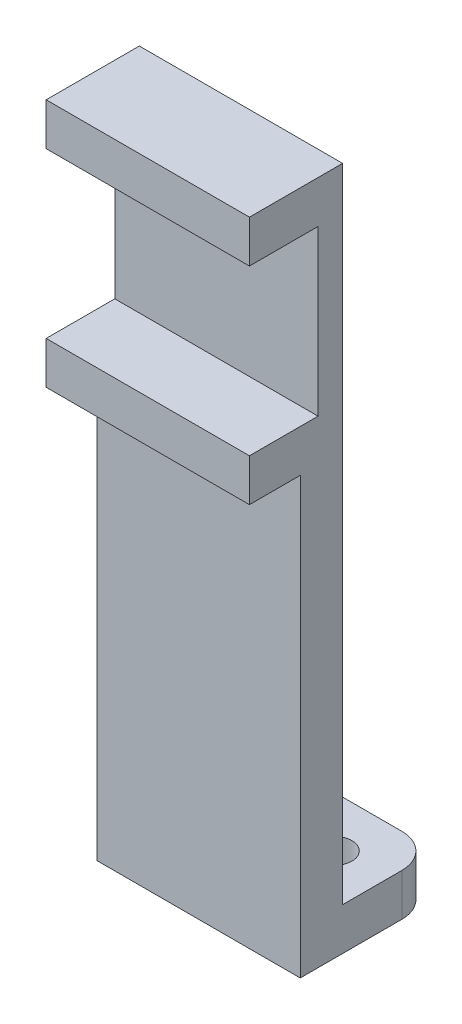
ISO-10303-21;
HEADER;
FILE_DESCRIPTION(('STEP AP214'),'2;1');
FILE_NAME('part.step','',(''),(''),'','','');
FILE_SCHEMA(('AUTOMOTIVE_DESIGN { 1 0 10303 214 1 1 1 1 }'));
ENDSEC;
DATA;
#1=APPLICATION_CONTEXT('core data for automotive mechanical design processes');
#2=APPLICATION_PROTOCOL_DEFINITION('international standard','automotive_design',2000,#1);
#3=PRODUCT_CONTEXT('',#1,'mechanical');
#4=PRODUCT('Part','Part','',(#3));
#5=PRODUCT_RELATED_PRODUCT_CATEGORY('part','',(#4));
#6=PRODUCT_DEFINITION_FORMATION('','',#4);
#7=PRODUCT_DEFINITION_CONTEXT('part definition',#1,'design');
#8=PRODUCT_DEFINITION('design','',#6,#7);
#9=PRODUCT_DEFINITION_SHAPE('','',#8);
#10=(LENGTH_UNIT() NAMED_UNIT(*) SI_UNIT(.MILLI.,.METRE.));
#11=(NAMED_UNIT(*) PLANE_ANGLE_UNIT() SI_UNIT($,.RADIAN.));
#12=(NAMED_UNIT(*) SI_UNIT($,.STERADIAN.) SOLID_ANGLE_UNIT());
#13=UNCERTAINTY_MEASURE_WITH_UNIT(LENGTH_MEASURE(1.E-05),#10,'distance_accuracy_value','');
#14=(GEOMETRIC_REPRESENTATION_CONTEXT(3) GLOBAL_UNCERTAINTY_ASSIGNED_CONTEXT((#13)) GLOBAL_UNIT_ASSIGNED_CONTEXT((#10,
#11,#12)) REPRESENTATION_CONTEXT('',''));
#15=CARTESIAN_POINT('',(0.,0.,0.));
#16=DIRECTION('',(0.,0.,1.));
#17=DIRECTION('',(1.,0.,0.));
#18=AXIS2_PLACEMENT_3D('',#15,#16,#17);
#19=CARTESIAN_POINT('',(-6.,2.5,4.));
#20=DIRECTION('',(0.,0.,-1.));
#21=DIRECTION('',(-1.,0.,0.));
#22=AXIS2_PLACEMENT_3D('',#19,#20,#21);
#23=PLANE('',#22);
#24=DIRECTION('',(1.,0.,0.));
#25=VECTOR('',#24,1.);
#26=CARTESIAN_POINT('',(-6.,25.7,4.));
#27=LINE('',#26,#25);
#28=CARTESIAN_POINT('',(-6.,25.7,4.));
#29=VERTEX_POINT('',#28);
#30=CARTESIAN_POINT('',(6.,25.7,4.));
#31=VERTEX_POINT('',#30);
#32=EDGE_CURVE('E184',#29,#31,#27,.T.);
#33=ORIENTED_EDGE('',*,*,#32,.F.);
#34=DIRECTION('',(0.,-1.,0.));
#35=VECTOR('',#34,1.);
#36=CARTESIAN_POINT('',(-6.,2.5,4.));
#37=LINE('',#36,#35);
#38=CARTESIAN_POINT('',(-6.,0.,4.));
#39=VERTEX_POINT('',#38);
#40=EDGE_CURVE('E290',#29,#39,#37,.T.);
#41=ORIENTED_EDGE('',*,*,#40,.T.);
#42=DIRECTION('',(1.,0.,0.));
#43=VECTOR('',#42,1.);
#44=CARTESIAN_POINT('',(-6.,0.,4.));
#45=LINE('',#44,#43);
#46=CARTESIAN_POINT('',(6.,0.,4.));
#47=VERTEX_POINT('',#46);
#48=EDGE_CURVE('E268',#39,#47,#45,.T.);
#49=ORIENTED_EDGE('',*,*,#48,.T.);
#50=DIRECTION('',(0.,-1.,0.));
#51=VECTOR('',#50,1.);
#52=CARTESIAN_POINT('',(6.,2.5,4.));
#53=LINE('',#52,#51);
#54=EDGE_CURVE('E61',#31,#47,#53,.T.);
#55=ORIENTED_EDGE('',*,*,#54,.F.);
#56=EDGE_LOOP('',(#33,#41,#49,#55));
#57=FACE_BOUND('',#56,.T.);
#58=ADVANCED_FACE('F45',(#57),#23,.F.);
#59=CARTESIAN_POINT('',(0.,2.5,0.));
#60=DIRECTION('',(0.,-1.,0.));
#61=DIRECTION('',(0.,0.,-1.));
#62=AXIS2_PLACEMENT_3D('',#59,#60,#61);
#63=PLANE('',#62);
#64=CARTESIAN_POINT('',(-3.,2.5,-1.));
#65=DIRECTION('',(0.,1.,0.));
#66=DIRECTION('',(0.,0.,1.));
#67=AXIS2_PLACEMENT_3D('',#64,#65,#66);
#68=CIRCLE('',#67,1.05);
#69=CARTESIAN_POINT('',(-3.,2.5,0.0500000000000003));
#70=VERTEX_POINT('',#69);
#71=EDGE_CURVE('E257',#70,#70,#68,.T.);
#72=ORIENTED_EDGE('',*,*,#71,.F.);
#73=EDGE_LOOP('',(#72));
#74=FACE_BOUND('',#73,.T.);
#75=CARTESIAN_POINT('',(3.,2.5,-1.));
#76=DIRECTION('',(0.,1.,0.));
#77=DIRECTION('',(0.,0.,1.));
#78=AXIS2_PLACEMENT_3D('',#75,#76,#77);
#79=CIRCLE('',#78,1.05);
#80=CARTESIAN_POINT('',(3.,2.5,0.0499999999999995));
#81=VERTEX_POINT('',#80);
#82=EDGE_CURVE('E253',#81,#81,#79,.T.);
#83=ORIENTED_EDGE('',*,*,#82,.F.);
#84=EDGE_LOOP('',(#83));
#85=FACE_BOUND('',#84,.T.);
#86=DIRECTION('',(-1.,0.,0.));
#87=VECTOR('',#86,1.);
#88=CARTESIAN_POINT('',(-6.,2.5,1.5));
#89=LINE('',#88,#87);
#90=CARTESIAN_POINT('',(6.,2.5,1.5));
#91=VERTEX_POINT('',#90);
#92=CARTESIAN_POINT('',(-6.,2.5,1.5));
#93=VERTEX_POINT('',#92);
#94=EDGE_CURVE('E69',#91,#93,#89,.T.);
#95=ORIENTED_EDGE('',*,*,#94,.F.);
#96=DIRECTION('',(0.,0.,-1.));
#97=VECTOR('',#96,1.);
#98=CARTESIAN_POINT('',(6.,2.5,4.));
#99=LINE('',#98,#97);
#100=CARTESIAN_POINT('',(6.,2.5,-2.));
#101=VERTEX_POINT('',#100);
#102=EDGE_CURVE('E264',#91,#101,#99,.T.);
#103=ORIENTED_EDGE('',*,*,#102,.T.);
#104=CARTESIAN_POINT('',(4.,2.5,-2.));
#105=DIRECTION('',(0.,-1.,0.));
#106=DIRECTION('',(0.,0.,-1.));
#107=AXIS2_PLACEMENT_3D('',#104,#105,#106);
#108=CIRCLE('',#107,2.);
#109=CARTESIAN_POINT('',(4.,2.5,-4.));
#110=VERTEX_POINT('',#109);
#111=EDGE_CURVE('E310',#101,#110,#108,.F.);
#112=ORIENTED_EDGE('',*,*,#111,.T.);
#113=DIRECTION('',(-1.,0.,0.));
#114=VECTOR('',#113,1.);
#115=CARTESIAN_POINT('',(-6.,2.5,-4.));
#116=LINE('',#115,#114);
#117=CARTESIAN_POINT('',(-4.,2.5,-4.));
#118=VERTEX_POINT('',#117);
#119=EDGE_CURVE('E267',#110,#118,#116,.T.);
#120=ORIENTED_EDGE('',*,*,#119,.T.);
#121=CARTESIAN_POINT('',(-4.,2.5,-2.));
#122=DIRECTION('',(0.,-1.,0.));
#123=DIRECTION('',(0.,0.,-1.));
#124=AXIS2_PLACEMENT_3D('',#121,#122,#123);
#125=CIRCLE('',#124,2.);
#126=CARTESIAN_POINT('',(-6.,2.5,-2.));
#127=VERTEX_POINT('',#126);
#128=EDGE_CURVE('E54',#118,#127,#125,.F.);
#129=ORIENTED_EDGE('',*,*,#128,.T.);
#130=DIRECTION('',(0.,0.,1.));
#131=VECTOR('',#130,1.);
#132=CARTESIAN_POINT('',(-6.,2.5,4.));
#133=LINE('',#132,#131);
#134=EDGE_CURVE('E272',#127,#93,#133,.T.);
#135=ORIENTED_EDGE('',*,*,#134,.T.);
#136=EDGE_LOOP('',(#95,#103,#112,#120,#129,#135));
#137=FACE_BOUND('',#136,.T.);
#138=ADVANCED_FACE('F315',(#74,#85,#137),#63,.F.);
#139=CARTESIAN_POINT('',(6.,2.5,4.));
#140=DIRECTION('',(-1.,0.,0.));
#141=DIRECTION('',(0.,0.,1.));
#142=AXIS2_PLACEMENT_3D('',#139,#140,#141);
#143=PLANE('',#142);
#144=DIRECTION('',(0.,-1.,0.));
#145=VECTOR('',#144,1.);
#146=CARTESIAN_POINT('',(6.,2.5,2.95));
#147=LINE('',#146,#145);
#148=CARTESIAN_POINT('',(6.,37.9,2.95));
#149=VERTEX_POINT('',#148);
#150=CARTESIAN_POINT('',(6.,28.2,2.95));
#151=VERTEX_POINT('',#150);
#152=EDGE_CURVE('E168',#149,#151,#147,.T.);
#153=ORIENTED_EDGE('',*,*,#152,.T.);
#154=DIRECTION('',(0.,0.,-1.));
#155=VECTOR('',#154,1.);
#156=CARTESIAN_POINT('',(6.,28.2,7.));
#157=LINE('',#156,#155);
#158=CARTESIAN_POINT('',(6.,28.2,7.));
#159=VERTEX_POINT('',#158);
#160=EDGE_CURVE('E202',#159,#151,#157,.T.);
#161=ORIENTED_EDGE('',*,*,#160,.F.);
#162=DIRECTION('',(0.,1.,0.));
#163=VECTOR('',#162,1.);
#164=CARTESIAN_POINT('',(6.,28.2,7.));
#165=LINE('',#164,#163);
#166=CARTESIAN_POINT('',(6.,25.7,7.));
#167=VERTEX_POINT('',#166);
#168=EDGE_CURVE('E192',#167,#159,#165,.T.);
#169=ORIENTED_EDGE('',*,*,#168,.F.);
#170=DIRECTION('',(0.,0.,-1.));
#171=VECTOR('',#170,1.);
#172=CARTESIAN_POINT('',(6.,25.7,7.));
#173=LINE('',#172,#171);
#174=EDGE_CURVE('E205',#167,#31,#173,.T.);
#175=ORIENTED_EDGE('',*,*,#174,.T.);
#176=ORIENTED_EDGE('',*,*,#54,.T.);
#177=DIRECTION('',(0.,0.,-1.));
#178=VECTOR('',#177,1.);
#179=CARTESIAN_POINT('',(6.,0.,4.));
#180=LINE('',#179,#178);
#181=CARTESIAN_POINT('',(6.,0.,-2.));
#182=VERTEX_POINT('',#181);
#183=EDGE_CURVE('E252',#47,#182,#180,.T.);
#184=ORIENTED_EDGE('',*,*,#183,.T.);
#185=DIRECTION('',(0.,-1.,0.));
#186=VECTOR('',#185,1.);
#187=CARTESIAN_POINT('',(6.,2.5,-2.));
#188=LINE('',#187,#186);
#189=EDGE_CURVE('E11',#182,#101,#188,.F.);
#190=ORIENTED_EDGE('',*,*,#189,.T.);
#191=ORIENTED_EDGE('',*,*,#102,.F.);
#192=DIRECTION('',(0.,-1.,0.));
#193=VECTOR('',#192,1.);
#194=CARTESIAN_POINT('',(6.,40.4,1.5));
#195=LINE('',#194,#193);
#196=CARTESIAN_POINT('',(6.,40.4,1.5));
#197=VERTEX_POINT('',#196);
#198=EDGE_CURVE('E243',#197,#91,#195,.T.);
#199=ORIENTED_EDGE('',*,*,#198,.F.);
#200=DIRECTION('',(0.,0.,-1.));
#201=VECTOR('',#200,1.);
#202=CARTESIAN_POINT('',(6.,40.4,4.));
#203=LINE('',#202,#201);
#204=CARTESIAN_POINT('',(6.,40.4,7.));
#205=VERTEX_POINT('',#204);
#206=EDGE_CURVE('E231',#205,#197,#203,.T.);
#207=ORIENTED_EDGE('',*,*,#206,.F.);
#208=DIRECTION('',(0.,1.,0.));
#209=VECTOR('',#208,1.);
#210=CARTESIAN_POINT('',(6.,40.4,7.));
#211=LINE('',#210,#209);
#212=CARTESIAN_POINT('',(6.,37.9,7.));
#213=VERTEX_POINT('',#212);
#214=EDGE_CURVE('E218',#213,#205,#211,.T.);
#215=ORIENTED_EDGE('',*,*,#214,.F.);
#216=DIRECTION('',(0.,0.,-1.));
#217=VECTOR('',#216,1.);
#218=CARTESIAN_POINT('',(6.,37.9,7.));
#219=LINE('',#218,#217);
#220=EDGE_CURVE('E159',#213,#149,#219,.T.);
#221=ORIENTED_EDGE('',*,*,#220,.T.);
#222=EDGE_LOOP('',(#153,#161,#169,#175,#176,#184,#190,#191,#199,#207,#215,#221));
#223=FACE_BOUND('',#222,.T.);
#224=ADVANCED_FACE('F336',(#223),#143,.F.);
#225=CARTESIAN_POINT('',(-6.,2.5,-4.));
#226=DIRECTION('',(0.,0.,1.));
#227=DIRECTION('',(1.,0.,0.));
#228=AXIS2_PLACEMENT_3D('',#225,#226,#227);
#229=PLANE('',#228);
#230=DIRECTION('',(-1.,0.,0.));
#231=VECTOR('',#230,1.);
#232=CARTESIAN_POINT('',(-6.,0.,-4.));
#233=LINE('',#232,#231);
#234=CARTESIAN_POINT('',(4.,0.,-4.));
#235=VERTEX_POINT('',#234);
#236=CARTESIAN_POINT('',(-4.,0.,-4.));
#237=VERTEX_POINT('',#236);
#238=EDGE_CURVE('E278',#235,#237,#233,.T.);
#239=ORIENTED_EDGE('',*,*,#238,.T.);
#240=DIRECTION('',(0.,-1.,0.));
#241=VECTOR('',#240,1.);
#242=CARTESIAN_POINT('',(-4.,2.5,-4.));
#243=LINE('',#242,#241);
#244=EDGE_CURVE('E307',#237,#118,#243,.F.);
#245=ORIENTED_EDGE('',*,*,#244,.T.);
#246=ORIENTED_EDGE('',*,*,#119,.F.);
#247=DIRECTION('',(0.,-1.,0.));
#248=VECTOR('',#247,1.);
#249=CARTESIAN_POINT('',(4.,2.5,-4.));
#250=LINE('',#249,#248);
#251=EDGE_CURVE('E303',#110,#235,#250,.T.);
#252=ORIENTED_EDGE('',*,*,#251,.T.);
#253=EDGE_LOOP('',(#239,#245,#246,#252));
#254=FACE_BOUND('',#253,.T.);
#255=ADVANCED_FACE('F329',(#254),#229,.F.);
#256=CARTESIAN_POINT('',(-6.,2.5,4.));
#257=DIRECTION('',(1.,0.,0.));
#258=DIRECTION('',(0.,0.,-1.));
#259=AXIS2_PLACEMENT_3D('',#256,#257,#258);
#260=PLANE('',#259);
#261=DIRECTION('',(0.,0.,-1.));
#262=VECTOR('',#261,1.);
#263=CARTESIAN_POINT('',(-6.,28.2,7.));
#264=LINE('',#263,#262);
#265=CARTESIAN_POINT('',(-6.,28.2,7.));
#266=VERTEX_POINT('',#265);
#267=CARTESIAN_POINT('',(-6.,28.2,2.95));
#268=VERTEX_POINT('',#267);
#269=EDGE_CURVE('E175',#266,#268,#264,.T.);
#270=ORIENTED_EDGE('',*,*,#269,.T.);
#271=DIRECTION('',(0.,-1.,0.));
#272=VECTOR('',#271,1.);
#273=CARTESIAN_POINT('',(-6.,37.9,2.95));
#274=LINE('',#273,#272);
#275=CARTESIAN_POINT('',(-6.,37.9,2.95));
#276=VERTEX_POINT('',#275);
#277=EDGE_CURVE('E166',#276,#268,#274,.T.);
#278=ORIENTED_EDGE('',*,*,#277,.F.);
#279=DIRECTION('',(0.,0.,-1.));
#280=VECTOR('',#279,1.);
#281=CARTESIAN_POINT('',(-6.,37.9,7.));
#282=LINE('',#281,#280);
#283=CARTESIAN_POINT('',(-6.,37.9,7.));
#284=VERTEX_POINT('',#283);
#285=EDGE_CURVE('E148',#284,#276,#282,.T.);
#286=ORIENTED_EDGE('',*,*,#285,.F.);
#287=DIRECTION('',(0.,-1.,0.));
#288=VECTOR('',#287,1.);
#289=CARTESIAN_POINT('',(-6.,40.4,7.));
#290=LINE('',#289,#288);
#291=CARTESIAN_POINT('',(-6.,40.4,7.));
#292=VERTEX_POINT('',#291);
#293=EDGE_CURVE('E213',#292,#284,#290,.T.);
#294=ORIENTED_EDGE('',*,*,#293,.F.);
#295=DIRECTION('',(0.,0.,1.));
#296=VECTOR('',#295,1.);
#297=CARTESIAN_POINT('',(-6.,40.4,4.));
#298=LINE('',#297,#296);
#299=CARTESIAN_POINT('',(-6.,40.4,1.5));
#300=VERTEX_POINT('',#299);
#301=EDGE_CURVE('E228',#300,#292,#298,.T.);
#302=ORIENTED_EDGE('',*,*,#301,.F.);
#303=DIRECTION('',(0.,-1.,0.));
#304=VECTOR('',#303,1.);
#305=CARTESIAN_POINT('',(-6.,40.4,1.5));
#306=LINE('',#305,#304);
#307=EDGE_CURVE('E237',#300,#93,#306,.T.);
#308=ORIENTED_EDGE('',*,*,#307,.T.);
#309=ORIENTED_EDGE('',*,*,#134,.F.);
#310=DIRECTION('',(0.,-1.,0.));
#311=VECTOR('',#310,1.);
#312=CARTESIAN_POINT('',(-6.,2.5,-2.));
#313=LINE('',#312,#311);
#314=CARTESIAN_POINT('',(-6.,0.,-2.));
#315=VERTEX_POINT('',#314);
#316=EDGE_CURVE('E293',#127,#315,#313,.T.);
#317=ORIENTED_EDGE('',*,*,#316,.T.);
#318=DIRECTION('',(0.,0.,1.));
#319=VECTOR('',#318,1.);
#320=CARTESIAN_POINT('',(-6.,0.,4.));
#321=LINE('',#320,#319);
#322=EDGE_CURVE('E282',#315,#39,#321,.T.);
#323=ORIENTED_EDGE('',*,*,#322,.T.);
#324=ORIENTED_EDGE('',*,*,#40,.F.);
#325=DIRECTION('',(0.,0.,-1.));
#326=VECTOR('',#325,1.);
#327=CARTESIAN_POINT('',(-6.,25.7,7.));
#328=LINE('',#327,#326);
#329=CARTESIAN_POINT('',(-6.,25.7,7.));
#330=VERTEX_POINT('',#329);
#331=EDGE_CURVE('E209',#330,#29,#328,.T.);
#332=ORIENTED_EDGE('',*,*,#331,.F.);
#333=DIRECTION('',(0.,-1.,0.));
#334=VECTOR('',#333,1.);
#335=CARTESIAN_POINT('',(-6.,28.2,7.));
#336=LINE('',#335,#334);
#337=EDGE_CURVE('E185',#266,#330,#336,.T.);
#338=ORIENTED_EDGE('',*,*,#337,.F.);
#339=EDGE_LOOP('',(#270,#278,#286,#294,#302,#308,#309,#317,#323,#324,#332,#338));
#340=FACE_BOUND('',#339,.T.);
#341=ADVANCED_FACE('F172',(#340),#260,.F.);
#342=CARTESIAN_POINT('',(0.,0.,0.));
#343=DIRECTION('',(0.,-1.,0.));
#344=DIRECTION('',(0.,0.,-1.));
#345=AXIS2_PLACEMENT_3D('',#342,#343,#344);
#346=PLANE('',#345);
#347=CARTESIAN_POINT('',(3.,0.,-1.));
#348=DIRECTION('',(0.,1.,0.));
#349=DIRECTION('',(0.,0.,1.));
#350=AXIS2_PLACEMENT_3D('',#347,#348,#349);
#351=CIRCLE('',#350,1.05);
#352=CARTESIAN_POINT('',(3.,0.,0.0499999999999995));
#353=VERTEX_POINT('',#352);
#354=EDGE_CURVE('E248',#353,#353,#351,.T.);
#355=ORIENTED_EDGE('',*,*,#354,.T.);
#356=EDGE_LOOP('',(#355));
#357=FACE_BOUND('',#356,.T.);
#358=CARTESIAN_POINT('',(-3.,0.,-1.));
#359=DIRECTION('',(0.,1.,0.));
#360=DIRECTION('',(0.,0.,1.));
#361=AXIS2_PLACEMENT_3D('',#358,#359,#360);
#362=CIRCLE('',#361,1.05);
#363=CARTESIAN_POINT('',(-3.,0.,0.0500000000000003));
#364=VERTEX_POINT('',#363);
#365=EDGE_CURVE('E247',#364,#364,#362,.T.);
#366=ORIENTED_EDGE('',*,*,#365,.T.);
#367=EDGE_LOOP('',(#366));
#368=FACE_BOUND('',#367,.T.);
#369=ORIENTED_EDGE('',*,*,#322,.F.);
#370=CARTESIAN_POINT('',(-4.,0.,-2.));
#371=DIRECTION('',(0.,-1.,0.));
#372=DIRECTION('',(0.,0.,-1.));
#373=AXIS2_PLACEMENT_3D('',#370,#371,#372);
#374=CIRCLE('',#373,2.);
#375=EDGE_CURVE('E300',#315,#237,#374,.T.);
#376=ORIENTED_EDGE('',*,*,#375,.T.);
#377=ORIENTED_EDGE('',*,*,#238,.F.);
#378=CARTESIAN_POINT('',(4.,0.,-2.));
#379=DIRECTION('',(0.,-1.,0.));
#380=DIRECTION('',(0.,0.,-1.));
#381=AXIS2_PLACEMENT_3D('',#378,#379,#380);
#382=CIRCLE('',#381,2.);
#383=EDGE_CURVE('E297',#235,#182,#382,.T.);
#384=ORIENTED_EDGE('',*,*,#383,.T.);
#385=ORIENTED_EDGE('',*,*,#183,.F.);
#386=ORIENTED_EDGE('',*,*,#48,.F.);
#387=EDGE_LOOP('',(#369,#376,#377,#384,#385,#386));
#388=FACE_BOUND('',#387,.T.);
#389=ADVANCED_FACE('F326',(#357,#368,#388),#346,.T.);
#390=CARTESIAN_POINT('',(-4.,2.5,-2.));
#391=DIRECTION('',(0.,-1.,0.));
#392=DIRECTION('',(0.,0.,-1.));
#393=AXIS2_PLACEMENT_3D('',#390,#391,#392);
#394=CYLINDRICAL_SURFACE('',#393,2.);
#395=ORIENTED_EDGE('',*,*,#128,.F.);
#396=ORIENTED_EDGE('',*,*,#244,.F.);
#397=ORIENTED_EDGE('',*,*,#375,.F.);
#398=ORIENTED_EDGE('',*,*,#316,.F.);
#399=EDGE_LOOP('',(#395,#396,#397,#398));
#400=FACE_BOUND('',#399,.T.);
#401=ADVANCED_FACE('F323',(#400),#394,.T.);
#402=CARTESIAN_POINT('',(4.,2.5,-2.));
#403=DIRECTION('',(0.,-1.,0.));
#404=DIRECTION('',(0.,0.,-1.));
#405=AXIS2_PLACEMENT_3D('',#402,#403,#404);
#406=CYLINDRICAL_SURFACE('',#405,2.);
#407=ORIENTED_EDGE('',*,*,#111,.F.);
#408=ORIENTED_EDGE('',*,*,#189,.F.);
#409=ORIENTED_EDGE('',*,*,#383,.F.);
#410=ORIENTED_EDGE('',*,*,#251,.F.);
#411=EDGE_LOOP('',(#407,#408,#409,#410));
#412=FACE_BOUND('',#411,.T.);
#413=ADVANCED_FACE('F47',(#412),#406,.T.);
#414=CARTESIAN_POINT('',(-3.,0.,-1.));
#415=DIRECTION('',(0.,1.,0.));
#416=DIRECTION('',(0.,0.,1.));
#417=AXIS2_PLACEMENT_3D('',#414,#415,#416);
#418=CYLINDRICAL_SURFACE('',#417,1.05);
#419=ORIENTED_EDGE('',*,*,#365,.F.);
#420=EDGE_LOOP('',(#419));
#421=FACE_BOUND('',#420,.T.);
#422=ORIENTED_EDGE('',*,*,#71,.T.);
#423=EDGE_LOOP('',(#422));
#424=FACE_BOUND('',#423,.T.);
#425=ADVANCED_FACE('F367',(#421,#424),#418,.F.);
#426=CARTESIAN_POINT('',(3.,0.,-1.));
#427=DIRECTION('',(0.,1.,0.));
#428=DIRECTION('',(0.,0.,1.));
#429=AXIS2_PLACEMENT_3D('',#426,#427,#428);
#430=CYLINDRICAL_SURFACE('',#429,1.05);
#431=ORIENTED_EDGE('',*,*,#354,.F.);
#432=EDGE_LOOP('',(#431));
#433=FACE_BOUND('',#432,.T.);
#434=ORIENTED_EDGE('',*,*,#82,.T.);
#435=EDGE_LOOP('',(#434));
#436=FACE_BOUND('',#435,.T.);
#437=ADVANCED_FACE('F359',(#433,#436),#430,.F.);
#438=CARTESIAN_POINT('',(-6.,40.4,1.5));
#439=DIRECTION('',(0.,0.,1.));
#440=DIRECTION('',(1.,0.,0.));
#441=AXIS2_PLACEMENT_3D('',#438,#439,#440);
#442=PLANE('',#441);
#443=ORIENTED_EDGE('',*,*,#94,.T.);
#444=ORIENTED_EDGE('',*,*,#307,.F.);
#445=DIRECTION('',(-1.,0.,0.));
#446=VECTOR('',#445,1.);
#447=CARTESIAN_POINT('',(-6.,40.4,1.5));
#448=LINE('',#447,#446);
#449=EDGE_CURVE('E234',#197,#300,#448,.T.);
#450=ORIENTED_EDGE('',*,*,#449,.F.);
#451=ORIENTED_EDGE('',*,*,#198,.T.);
#452=EDGE_LOOP('',(#443,#444,#450,#451));
#453=FACE_BOUND('',#452,.T.);
#454=ADVANCED_FACE('F357',(#453),#442,.F.);
#455=CARTESIAN_POINT('',(0.,40.4,0.));
#456=DIRECTION('',(0.,-1.,0.));
#457=DIRECTION('',(0.,0.,-1.));
#458=AXIS2_PLACEMENT_3D('',#455,#456,#457);
#459=PLANE('',#458);
#460=ORIENTED_EDGE('',*,*,#301,.T.);
#461=DIRECTION('',(-1.,0.,0.));
#462=VECTOR('',#461,1.);
#463=CARTESIAN_POINT('',(-6.,40.4,7.));
#464=LINE('',#463,#462);
#465=EDGE_CURVE('E222',#205,#292,#464,.T.);
#466=ORIENTED_EDGE('',*,*,#465,.F.);
#467=ORIENTED_EDGE('',*,*,#206,.T.);
#468=ORIENTED_EDGE('',*,*,#449,.T.);
#469=EDGE_LOOP('',(#460,#466,#467,#468));
#470=FACE_BOUND('',#469,.T.);
#471=ADVANCED_FACE('F354',(#470),#459,.F.);
#472=CARTESIAN_POINT('',(-6.,37.9,7.));
#473=DIRECTION('',(0.,1.,0.));
#474=DIRECTION('',(0.,0.,1.));
#475=AXIS2_PLACEMENT_3D('',#472,#473,#474);
#476=PLANE('',#475);
#477=ORIENTED_EDGE('',*,*,#285,.T.);
#478=DIRECTION('',(-1.,0.,0.));
#479=VECTOR('',#478,1.);
#480=CARTESIAN_POINT('',(9.00000000000001,37.9,2.95));
#481=LINE('',#480,#479);
#482=EDGE_CURVE('E152',#149,#276,#481,.T.);
#483=ORIENTED_EDGE('',*,*,#482,.F.);
#484=ORIENTED_EDGE('',*,*,#220,.F.);
#485=DIRECTION('',(1.,0.,0.));
#486=VECTOR('',#485,1.);
#487=CARTESIAN_POINT('',(-6.,37.9,7.));
#488=LINE('',#487,#486);
#489=EDGE_CURVE('E153',#284,#213,#488,.T.);
#490=ORIENTED_EDGE('',*,*,#489,.F.);
#491=EDGE_LOOP('',(#477,#483,#484,#490));
#492=FACE_BOUND('',#491,.T.);
#493=ADVANCED_FACE('F150',(#492),#476,.F.);
#494=CARTESIAN_POINT('',(0.,0.,7.));
#495=DIRECTION('',(0.,0.,1.));
#496=DIRECTION('',(1.,0.,0.));
#497=AXIS2_PLACEMENT_3D('',#494,#495,#496);
#498=PLANE('',#497);
#499=ORIENTED_EDGE('',*,*,#293,.T.);
#500=ORIENTED_EDGE('',*,*,#489,.T.);
#501=ORIENTED_EDGE('',*,*,#214,.T.);
#502=ORIENTED_EDGE('',*,*,#465,.T.);
#503=EDGE_LOOP('',(#499,#500,#501,#502));
#504=FACE_BOUND('',#503,.T.);
#505=ADVANCED_FACE('F352',(#504),#498,.T.);
#506=CARTESIAN_POINT('',(-6.,25.7,7.));
#507=DIRECTION('',(0.,1.,0.));
#508=DIRECTION('',(0.,0.,1.));
#509=AXIS2_PLACEMENT_3D('',#506,#507,#508);
#510=PLANE('',#509);
#511=ORIENTED_EDGE('',*,*,#32,.T.);
#512=ORIENTED_EDGE('',*,*,#174,.F.);
#513=DIRECTION('',(1.,0.,0.));
#514=VECTOR('',#513,1.);
#515=CARTESIAN_POINT('',(-6.,25.7,7.));
#516=LINE('',#515,#514);
#517=EDGE_CURVE('E189',#330,#167,#516,.T.);
#518=ORIENTED_EDGE('',*,*,#517,.F.);
#519=ORIENTED_EDGE('',*,*,#331,.T.);
#520=EDGE_LOOP('',(#511,#512,#518,#519));
#521=FACE_BOUND('',#520,.T.);
#522=ADVANCED_FACE('F341',(#521),#510,.F.);
#523=CARTESIAN_POINT('',(-6.,28.2,7.));
#524=DIRECTION('',(0.,-1.,0.));
#525=DIRECTION('',(0.,0.,-1.));
#526=AXIS2_PLACEMENT_3D('',#523,#524,#525);
#527=PLANE('',#526);
#528=ORIENTED_EDGE('',*,*,#160,.T.);
#529=DIRECTION('',(-1.,0.,0.));
#530=VECTOR('',#529,1.);
#531=CARTESIAN_POINT('',(9.00000000000001,28.2,2.95));
#532=LINE('',#531,#530);
#533=EDGE_CURVE('E170',#151,#268,#532,.T.);
#534=ORIENTED_EDGE('',*,*,#533,.T.);
#535=ORIENTED_EDGE('',*,*,#269,.F.);
#536=DIRECTION('',(-1.,0.,0.));
#537=VECTOR('',#536,1.);
#538=CARTESIAN_POINT('',(-6.,28.2,7.));
#539=LINE('',#538,#537);
#540=EDGE_CURVE('E195',#159,#266,#539,.T.);
#541=ORIENTED_EDGE('',*,*,#540,.F.);
#542=EDGE_LOOP('',(#528,#534,#535,#541));
#543=FACE_BOUND('',#542,.T.);
#544=ADVANCED_FACE('F347',(#543),#527,.F.);
#545=CARTESIAN_POINT('',(0.,0.,7.));
#546=DIRECTION('',(0.,0.,1.));
#547=DIRECTION('',(1.,0.,0.));
#548=AXIS2_PLACEMENT_3D('',#545,#546,#547);
#549=PLANE('',#548);
#550=ORIENTED_EDGE('',*,*,#337,.T.);
#551=ORIENTED_EDGE('',*,*,#517,.T.);
#552=ORIENTED_EDGE('',*,*,#168,.T.);
#553=ORIENTED_EDGE('',*,*,#540,.T.);
#554=EDGE_LOOP('',(#550,#551,#552,#553));
#555=FACE_BOUND('',#554,.T.);
#556=ADVANCED_FACE('F343',(#555),#549,.T.);
#557=CARTESIAN_POINT('',(9.00000000000001,37.9,2.95));
#558=DIRECTION('',(0.,0.,-1.));
#559=DIRECTION('',(0.,1.,0.));
#560=AXIS2_PLACEMENT_3D('',#557,#558,#559);
#561=PLANE('',#560);
#562=ORIENTED_EDGE('',*,*,#482,.T.);
#563=ORIENTED_EDGE('',*,*,#277,.T.);
#564=ORIENTED_EDGE('',*,*,#533,.F.);
#565=ORIENTED_EDGE('',*,*,#152,.F.);
#566=EDGE_LOOP('',(#562,#563,#564,#565));
#567=FACE_BOUND('',#566,.T.);
#568=ADVANCED_FACE('F164',(#567),#561,.F.);
#569=CLOSED_SHELL('',(#58,#138,#224,#255,#341,#389,#401,#413,#425,#437,#454,#471,#493,#505,#522,
#544,#556,#568));
#570=MANIFOLD_SOLID_BREP('B2',#569);
#571=ADVANCED_BREP_SHAPE_REPRESENTATION('',(#18,#570),#14);
#572=SHAPE_DEFINITION_REPRESENTATION(#9,#571);
ENDSEC;
END-ISO-10303-21;
